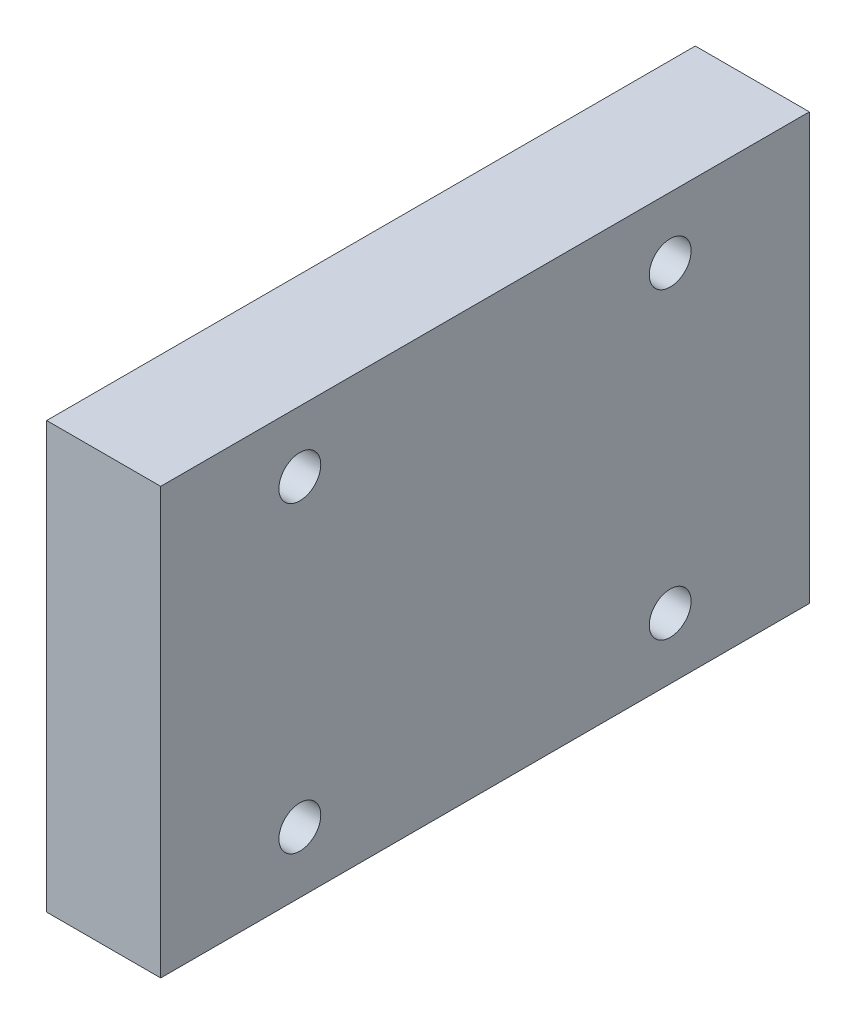
ISO-10303-21;
HEADER;
FILE_DESCRIPTION(('STEP AP214'),'2;1');
FILE_NAME('part.step','',(''),(''),'','','');
FILE_SCHEMA(('AUTOMOTIVE_DESIGN { 1 0 10303 214 1 1 1 1 }'));
ENDSEC;
DATA;
#1=APPLICATION_CONTEXT('core data for automotive mechanical design processes');
#2=APPLICATION_PROTOCOL_DEFINITION('international standard','automotive_design',2000,#1);
#3=PRODUCT_CONTEXT('',#1,'mechanical');
#4=PRODUCT('Part','Part','',(#3));
#5=PRODUCT_RELATED_PRODUCT_CATEGORY('part','',(#4));
#6=PRODUCT_DEFINITION_FORMATION('','',#4);
#7=PRODUCT_DEFINITION_CONTEXT('part definition',#1,'design');
#8=PRODUCT_DEFINITION('design','',#6,#7);
#9=PRODUCT_DEFINITION_SHAPE('','',#8);
#10=(LENGTH_UNIT() NAMED_UNIT(*) SI_UNIT(.MILLI.,.METRE.));
#11=(NAMED_UNIT(*) PLANE_ANGLE_UNIT() SI_UNIT($,.RADIAN.));
#12=(NAMED_UNIT(*) SI_UNIT($,.STERADIAN.) SOLID_ANGLE_UNIT());
#13=UNCERTAINTY_MEASURE_WITH_UNIT(LENGTH_MEASURE(1.E-05),#10,'distance_accuracy_value','');
#14=(GEOMETRIC_REPRESENTATION_CONTEXT(3) GLOBAL_UNCERTAINTY_ASSIGNED_CONTEXT((#13)) GLOBAL_UNIT_ASSIGNED_CONTEXT((#10,
#11,#12)) REPRESENTATION_CONTEXT('',''));
#15=CARTESIAN_POINT('',(0.,0.,0.));
#16=DIRECTION('',(0.,0.,1.));
#17=DIRECTION('',(1.,0.,0.));
#18=AXIS2_PLACEMENT_3D('',#15,#16,#17);
#19=CARTESIAN_POINT('',(5.45,0.,0.));
#20=DIRECTION('',(-1.,0.,0.));
#21=DIRECTION('',(0.,0.,1.));
#22=AXIS2_PLACEMENT_3D('',#19,#20,#21);
#23=PLANE('',#22);
#24=DIRECTION('',(0.,-1.,0.));
#25=VECTOR('',#24,1.);
#26=CARTESIAN_POINT('',(5.45,0.,0.));
#27=LINE('',#26,#25);
#28=CARTESIAN_POINT('',(5.45,20.35,0.));
#29=VERTEX_POINT('',#28);
#30=CARTESIAN_POINT('',(5.45,0.,0.));
#31=VERTEX_POINT('',#30);
#32=EDGE_CURVE('E91',#29,#31,#27,.T.);
#33=ORIENTED_EDGE('',*,*,#32,.T.);
#34=DIRECTION('',(0.,0.,-1.));
#35=VECTOR('',#34,1.);
#36=CARTESIAN_POINT('',(5.45,0.,0.));
#37=LINE('',#36,#35);
#38=CARTESIAN_POINT('',(5.45,0.,-31.));
#39=VERTEX_POINT('',#38);
#40=EDGE_CURVE('E86',#31,#39,#37,.T.);
#41=ORIENTED_EDGE('',*,*,#40,.T.);
#42=DIRECTION('',(0.,1.,0.));
#43=VECTOR('',#42,1.);
#44=CARTESIAN_POINT('',(5.45,0.,-31.));
#45=LINE('',#44,#43);
#46=CARTESIAN_POINT('',(5.45,20.35,-31.));
#47=VERTEX_POINT('',#46);
#48=EDGE_CURVE('E89',#39,#47,#45,.T.);
#49=ORIENTED_EDGE('',*,*,#48,.T.);
#50=DIRECTION('',(0.,0.,1.));
#51=VECTOR('',#50,1.);
#52=CARTESIAN_POINT('',(5.45,20.35,0.));
#53=LINE('',#52,#51);
#54=EDGE_CURVE('E56',#47,#29,#53,.T.);
#55=ORIENTED_EDGE('',*,*,#54,.T.);
#56=EDGE_LOOP('',(#33,#41,#49,#55));
#57=FACE_BOUND('',#56,.T.);
#58=CARTESIAN_POINT('',(5.45,2.925,-6.65));
#59=DIRECTION('',(1.,0.,0.));
#60=DIRECTION('',(0.,0.,-1.));
#61=AXIS2_PLACEMENT_3D('',#58,#59,#60);
#62=CIRCLE('',#61,1.);
#63=CARTESIAN_POINT('',(5.45,2.925,-7.65));
#64=VERTEX_POINT('',#63);
#65=EDGE_CURVE('E106',#64,#64,#62,.T.);
#66=ORIENTED_EDGE('',*,*,#65,.F.);
#67=EDGE_LOOP('',(#66));
#68=FACE_BOUND('',#67,.T.);
#69=CARTESIAN_POINT('',(5.45,17.425,-6.65));
#70=DIRECTION('',(1.,0.,0.));
#71=DIRECTION('',(0.,0.,-1.));
#72=AXIS2_PLACEMENT_3D('',#69,#70,#71);
#73=CIRCLE('',#72,1.);
#74=CARTESIAN_POINT('',(5.45,17.425,-7.65));
#75=VERTEX_POINT('',#74);
#76=EDGE_CURVE('E121',#75,#75,#73,.T.);
#77=ORIENTED_EDGE('',*,*,#76,.F.);
#78=EDGE_LOOP('',(#77));
#79=FACE_BOUND('',#78,.T.);
#80=CARTESIAN_POINT('',(5.45,17.425,-24.35));
#81=DIRECTION('',(1.,0.,0.));
#82=DIRECTION('',(0.,0.,-1.));
#83=AXIS2_PLACEMENT_3D('',#80,#81,#82);
#84=CIRCLE('',#83,1.);
#85=CARTESIAN_POINT('',(5.45,17.425,-25.35));
#86=VERTEX_POINT('',#85);
#87=EDGE_CURVE('E127',#86,#86,#84,.T.);
#88=ORIENTED_EDGE('',*,*,#87,.F.);
#89=EDGE_LOOP('',(#88));
#90=FACE_BOUND('',#89,.T.);
#91=CARTESIAN_POINT('',(5.45,2.925,-24.35));
#92=DIRECTION('',(1.,0.,0.));
#93=DIRECTION('',(0.,0.,-1.));
#94=AXIS2_PLACEMENT_3D('',#91,#92,#93);
#95=CIRCLE('',#94,1.);
#96=CARTESIAN_POINT('',(5.45,2.925,-25.35));
#97=VERTEX_POINT('',#96);
#98=EDGE_CURVE('E133',#97,#97,#95,.T.);
#99=ORIENTED_EDGE('',*,*,#98,.F.);
#100=EDGE_LOOP('',(#99));
#101=FACE_BOUND('',#100,.T.);
#102=ADVANCED_FACE('F39',(#57,#68,#79,#90,#101),#23,.F.);
#103=CARTESIAN_POINT('',(0.,0.,0.));
#104=DIRECTION('',(-1.,0.,0.));
#105=DIRECTION('',(0.,0.,1.));
#106=AXIS2_PLACEMENT_3D('',#103,#104,#105);
#107=PLANE('',#106);
#108=CARTESIAN_POINT('',(0.,17.425,-24.35));
#109=DIRECTION('',(1.,0.,0.));
#110=DIRECTION('',(0.,0.,-1.));
#111=AXIS2_PLACEMENT_3D('',#108,#109,#110);
#112=CIRCLE('',#111,1.);
#113=CARTESIAN_POINT('',(0.,17.425,-25.35));
#114=VERTEX_POINT('',#113);
#115=EDGE_CURVE('E130',#114,#114,#112,.T.);
#116=ORIENTED_EDGE('',*,*,#115,.T.);
#117=EDGE_LOOP('',(#116));
#118=FACE_BOUND('',#117,.T.);
#119=CARTESIAN_POINT('',(0.,2.925,-6.65));
#120=DIRECTION('',(1.,0.,0.));
#121=DIRECTION('',(0.,0.,-1.));
#122=AXIS2_PLACEMENT_3D('',#119,#120,#121);
#123=CIRCLE('',#122,1.);
#124=CARTESIAN_POINT('',(0.,2.925,-7.65));
#125=VERTEX_POINT('',#124);
#126=EDGE_CURVE('E118',#125,#125,#123,.T.);
#127=ORIENTED_EDGE('',*,*,#126,.T.);
#128=EDGE_LOOP('',(#127));
#129=FACE_BOUND('',#128,.T.);
#130=DIRECTION('',(0.,-1.,0.));
#131=VECTOR('',#130,1.);
#132=CARTESIAN_POINT('',(0.,0.,0.));
#133=LINE('',#132,#131);
#134=CARTESIAN_POINT('',(0.,20.35,0.));
#135=VERTEX_POINT('',#134);
#136=CARTESIAN_POINT('',(0.,0.,0.));
#137=VERTEX_POINT('',#136);
#138=EDGE_CURVE('E103',#135,#137,#133,.T.);
#139=ORIENTED_EDGE('',*,*,#138,.F.);
#140=DIRECTION('',(0.,0.,1.));
#141=VECTOR('',#140,1.);
#142=CARTESIAN_POINT('',(0.,20.35,0.));
#143=LINE('',#142,#141);
#144=CARTESIAN_POINT('',(0.,20.35,-31.));
#145=VERTEX_POINT('',#144);
#146=EDGE_CURVE('E79',#145,#135,#143,.T.);
#147=ORIENTED_EDGE('',*,*,#146,.F.);
#148=DIRECTION('',(0.,1.,0.));
#149=VECTOR('',#148,1.);
#150=CARTESIAN_POINT('',(0.,0.,-31.));
#151=LINE('',#150,#149);
#152=CARTESIAN_POINT('',(0.,0.,-31.));
#153=VERTEX_POINT('',#152);
#154=EDGE_CURVE('E73',#153,#145,#151,.T.);
#155=ORIENTED_EDGE('',*,*,#154,.F.);
#156=DIRECTION('',(0.,0.,-1.));
#157=VECTOR('',#156,1.);
#158=CARTESIAN_POINT('',(0.,0.,0.));
#159=LINE('',#158,#157);
#160=EDGE_CURVE('E95',#137,#153,#159,.T.);
#161=ORIENTED_EDGE('',*,*,#160,.F.);
#162=EDGE_LOOP('',(#139,#147,#155,#161));
#163=FACE_BOUND('',#162,.T.);
#164=CARTESIAN_POINT('',(0.,17.425,-6.65));
#165=DIRECTION('',(1.,0.,0.));
#166=DIRECTION('',(0.,0.,-1.));
#167=AXIS2_PLACEMENT_3D('',#164,#165,#166);
#168=CIRCLE('',#167,1.);
#169=CARTESIAN_POINT('',(0.,17.425,-7.65));
#170=VERTEX_POINT('',#169);
#171=EDGE_CURVE('E124',#170,#170,#168,.T.);
#172=ORIENTED_EDGE('',*,*,#171,.T.);
#173=EDGE_LOOP('',(#172));
#174=FACE_BOUND('',#173,.T.);
#175=CARTESIAN_POINT('',(0.,2.925,-24.35));
#176=DIRECTION('',(1.,0.,0.));
#177=DIRECTION('',(0.,0.,-1.));
#178=AXIS2_PLACEMENT_3D('',#175,#176,#177);
#179=CIRCLE('',#178,1.);
#180=CARTESIAN_POINT('',(0.,2.925,-25.35));
#181=VERTEX_POINT('',#180);
#182=EDGE_CURVE('E136',#181,#181,#179,.T.);
#183=ORIENTED_EDGE('',*,*,#182,.T.);
#184=EDGE_LOOP('',(#183));
#185=FACE_BOUND('',#184,.T.);
#186=ADVANCED_FACE('F114',(#118,#129,#163,#174,#185),#107,.T.);
#187=CARTESIAN_POINT('',(5.45,0.,0.));
#188=DIRECTION('',(0.,0.,-1.));
#189=DIRECTION('',(-1.,0.,0.));
#190=AXIS2_PLACEMENT_3D('',#187,#188,#189);
#191=PLANE('',#190);
#192=ORIENTED_EDGE('',*,*,#138,.T.);
#193=DIRECTION('',(-1.,0.,0.));
#194=VECTOR('',#193,1.);
#195=CARTESIAN_POINT('',(5.45,0.,0.));
#196=LINE('',#195,#194);
#197=EDGE_CURVE('E11',#31,#137,#196,.T.);
#198=ORIENTED_EDGE('',*,*,#197,.F.);
#199=ORIENTED_EDGE('',*,*,#32,.F.);
#200=DIRECTION('',(-1.,0.,0.));
#201=VECTOR('',#200,1.);
#202=CARTESIAN_POINT('',(5.45,20.35,0.));
#203=LINE('',#202,#201);
#204=EDGE_CURVE('E99',#29,#135,#203,.T.);
#205=ORIENTED_EDGE('',*,*,#204,.T.);
#206=EDGE_LOOP('',(#192,#198,#199,#205));
#207=FACE_BOUND('',#206,.T.);
#208=ADVANCED_FACE('F41',(#207),#191,.F.);
#209=CARTESIAN_POINT('',(5.45,0.,0.));
#210=DIRECTION('',(0.,1.,0.));
#211=DIRECTION('',(0.,0.,1.));
#212=AXIS2_PLACEMENT_3D('',#209,#210,#211);
#213=PLANE('',#212);
#214=ORIENTED_EDGE('',*,*,#160,.T.);
#215=DIRECTION('',(-1.,0.,0.));
#216=VECTOR('',#215,1.);
#217=CARTESIAN_POINT('',(5.45,0.,-31.));
#218=LINE('',#217,#216);
#219=EDGE_CURVE('E48',#39,#153,#218,.T.);
#220=ORIENTED_EDGE('',*,*,#219,.F.);
#221=ORIENTED_EDGE('',*,*,#40,.F.);
#222=ORIENTED_EDGE('',*,*,#197,.T.);
#223=EDGE_LOOP('',(#214,#220,#221,#222));
#224=FACE_BOUND('',#223,.T.);
#225=ADVANCED_FACE('F94',(#224),#213,.F.);
#226=CARTESIAN_POINT('',(5.45,0.,-31.));
#227=DIRECTION('',(0.,0.,1.));
#228=DIRECTION('',(1.,0.,0.));
#229=AXIS2_PLACEMENT_3D('',#226,#227,#228);
#230=PLANE('',#229);
#231=ORIENTED_EDGE('',*,*,#154,.T.);
#232=DIRECTION('',(-1.,0.,0.));
#233=VECTOR('',#232,1.);
#234=CARTESIAN_POINT('',(5.45,20.35,-31.));
#235=LINE('',#234,#233);
#236=EDGE_CURVE('E96',#47,#145,#235,.T.);
#237=ORIENTED_EDGE('',*,*,#236,.F.);
#238=ORIENTED_EDGE('',*,*,#48,.F.);
#239=ORIENTED_EDGE('',*,*,#219,.T.);
#240=EDGE_LOOP('',(#231,#237,#238,#239));
#241=FACE_BOUND('',#240,.T.);
#242=ADVANCED_FACE('F97',(#241),#230,.F.);
#243=CARTESIAN_POINT('',(5.45,20.35,0.));
#244=DIRECTION('',(0.,-1.,0.));
#245=DIRECTION('',(0.,0.,-1.));
#246=AXIS2_PLACEMENT_3D('',#243,#244,#245);
#247=PLANE('',#246);
#248=ORIENTED_EDGE('',*,*,#146,.T.);
#249=ORIENTED_EDGE('',*,*,#204,.F.);
#250=ORIENTED_EDGE('',*,*,#54,.F.);
#251=ORIENTED_EDGE('',*,*,#236,.T.);
#252=EDGE_LOOP('',(#248,#249,#250,#251));
#253=FACE_BOUND('',#252,.T.);
#254=ADVANCED_FACE('F111',(#253),#247,.F.);
#255=CARTESIAN_POINT('',(5.45,2.925,-6.65));
#256=DIRECTION('',(-1.,0.,0.));
#257=DIRECTION('',(0.,0.,1.));
#258=AXIS2_PLACEMENT_3D('',#255,#256,#257);
#259=CYLINDRICAL_SURFACE('',#258,1.);
#260=ORIENTED_EDGE('',*,*,#65,.T.);
#261=EDGE_LOOP('',(#260));
#262=FACE_BOUND('',#261,.T.);
#263=ORIENTED_EDGE('',*,*,#126,.F.);
#264=EDGE_LOOP('',(#263));
#265=FACE_BOUND('',#264,.T.);
#266=ADVANCED_FACE('F153',(#262,#265),#259,.F.);
#267=CARTESIAN_POINT('',(5.45,17.425,-6.65));
#268=DIRECTION('',(-1.,0.,0.));
#269=DIRECTION('',(0.,0.,1.));
#270=AXIS2_PLACEMENT_3D('',#267,#268,#269);
#271=CYLINDRICAL_SURFACE('',#270,1.);
#272=ORIENTED_EDGE('',*,*,#76,.T.);
#273=EDGE_LOOP('',(#272));
#274=FACE_BOUND('',#273,.T.);
#275=ORIENTED_EDGE('',*,*,#171,.F.);
#276=EDGE_LOOP('',(#275));
#277=FACE_BOUND('',#276,.T.);
#278=ADVANCED_FACE('F198',(#274,#277),#271,.F.);
#279=CARTESIAN_POINT('',(5.45,17.425,-24.35));
#280=DIRECTION('',(-1.,0.,0.));
#281=DIRECTION('',(0.,0.,1.));
#282=AXIS2_PLACEMENT_3D('',#279,#280,#281);
#283=CYLINDRICAL_SURFACE('',#282,1.);
#284=ORIENTED_EDGE('',*,*,#87,.T.);
#285=EDGE_LOOP('',(#284));
#286=FACE_BOUND('',#285,.T.);
#287=ORIENTED_EDGE('',*,*,#115,.F.);
#288=EDGE_LOOP('',(#287));
#289=FACE_BOUND('',#288,.T.);
#290=ADVANCED_FACE('F206',(#286,#289),#283,.F.);
#291=CARTESIAN_POINT('',(5.45,2.925,-24.35));
#292=DIRECTION('',(-1.,0.,0.));
#293=DIRECTION('',(0.,0.,1.));
#294=AXIS2_PLACEMENT_3D('',#291,#292,#293);
#295=CYLINDRICAL_SURFACE('',#294,1.);
#296=ORIENTED_EDGE('',*,*,#98,.T.);
#297=EDGE_LOOP('',(#296));
#298=FACE_BOUND('',#297,.T.);
#299=ORIENTED_EDGE('',*,*,#182,.F.);
#300=EDGE_LOOP('',(#299));
#301=FACE_BOUND('',#300,.T.);
#302=ADVANCED_FACE('F142',(#298,#301),#295,.F.);
#303=CLOSED_SHELL('',(#102,#186,#208,#225,#242,#254,#266,#278,#290,#302));
#304=MANIFOLD_SOLID_BREP('B2',#303);
#305=ADVANCED_BREP_SHAPE_REPRESENTATION('',(#18,#304),#14);
#306=SHAPE_DEFINITION_REPRESENTATION(#9,#305);
ENDSEC;
END-ISO-10303-21;
